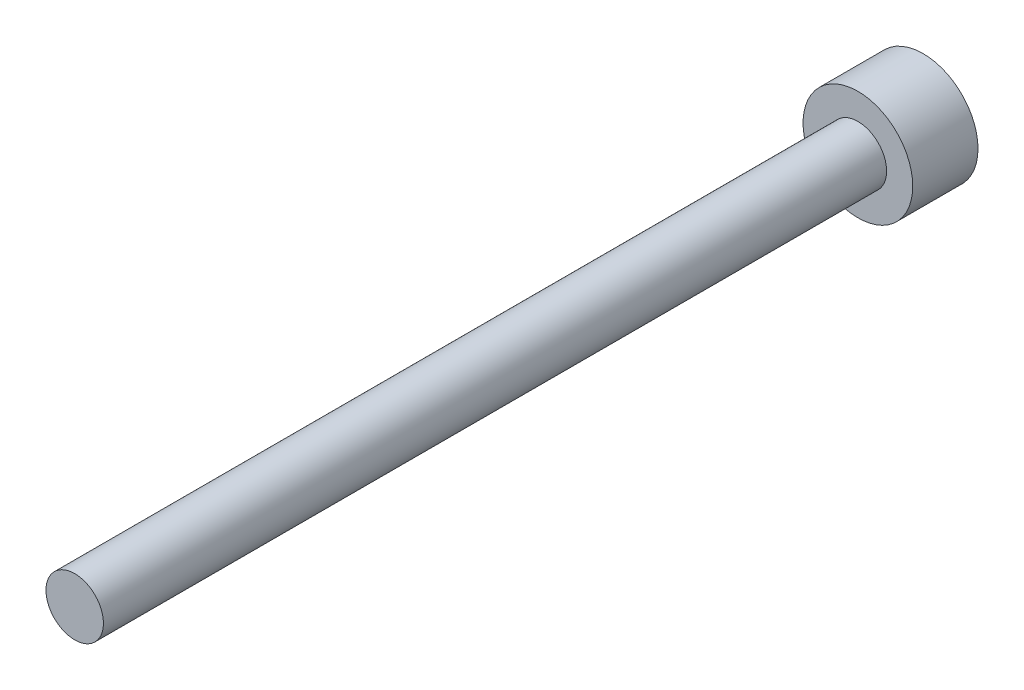
ISO-10303-21;
HEADER;
FILE_DESCRIPTION(('STEP AP214'),'2;1');
FILE_NAME('part.step','',(''),(''),'','','');
FILE_SCHEMA(('AUTOMOTIVE_DESIGN { 1 0 10303 214 1 1 1 1 }'));
ENDSEC;
DATA;
#1=APPLICATION_CONTEXT('core data for automotive mechanical design processes');
#2=APPLICATION_PROTOCOL_DEFINITION('international standard','automotive_design',2000,#1);
#3=PRODUCT_CONTEXT('',#1,'mechanical');
#4=PRODUCT('Part','Part','',(#3));
#5=PRODUCT_RELATED_PRODUCT_CATEGORY('part','',(#4));
#6=PRODUCT_DEFINITION_FORMATION('','',#4);
#7=PRODUCT_DEFINITION_CONTEXT('part definition',#1,'design');
#8=PRODUCT_DEFINITION('design','',#6,#7);
#9=PRODUCT_DEFINITION_SHAPE('','',#8);
#10=(LENGTH_UNIT() NAMED_UNIT(*) SI_UNIT(.MILLI.,.METRE.));
#11=(NAMED_UNIT(*) PLANE_ANGLE_UNIT() SI_UNIT($,.RADIAN.));
#12=(NAMED_UNIT(*) SI_UNIT($,.STERADIAN.) SOLID_ANGLE_UNIT());
#13=UNCERTAINTY_MEASURE_WITH_UNIT(LENGTH_MEASURE(1.E-05),#10,'distance_accuracy_value','');
#14=(GEOMETRIC_REPRESENTATION_CONTEXT(3) GLOBAL_UNCERTAINTY_ASSIGNED_CONTEXT((#13)) GLOBAL_UNIT_ASSIGNED_CONTEXT((#10,
#11,#12)) REPRESENTATION_CONTEXT('',''));
#15=CARTESIAN_POINT('',(0.,0.,0.));
#16=DIRECTION('',(0.,0.,1.));
#17=DIRECTION('',(1.,0.,0.));
#18=AXIS2_PLACEMENT_3D('',#15,#16,#17);
#19=CARTESIAN_POINT('',(0.,0.,6.35));
#20=DIRECTION('',(0.,0.,-1.));
#21=DIRECTION('',(-1.,0.,0.));
#22=AXIS2_PLACEMENT_3D('',#19,#20,#21);
#23=CYLINDRICAL_SURFACE('',#22,5.334);
#24=CARTESIAN_POINT('',(0.,0.,6.35));
#25=DIRECTION('',(0.,0.,1.));
#26=DIRECTION('',(1.,0.,0.));
#27=AXIS2_PLACEMENT_3D('',#24,#25,#26);
#28=CIRCLE('',#27,5.334);
#29=CARTESIAN_POINT('',(5.334,0.,6.35));
#30=VERTEX_POINT('',#29);
#31=EDGE_CURVE('E37',#30,#30,#28,.T.);
#32=ORIENTED_EDGE('',*,*,#31,.F.);
#33=EDGE_LOOP('',(#32));
#34=FACE_BOUND('',#33,.T.);
#35=CARTESIAN_POINT('',(0.,0.,0.));
#36=DIRECTION('',(0.,0.,1.));
#37=DIRECTION('',(1.,0.,0.));
#38=AXIS2_PLACEMENT_3D('',#35,#36,#37);
#39=CIRCLE('',#38,5.334);
#40=CARTESIAN_POINT('',(5.334,0.,0.));
#41=VERTEX_POINT('',#40);
#42=EDGE_CURVE('E33',#41,#41,#39,.T.);
#43=ORIENTED_EDGE('',*,*,#42,.T.);
#44=EDGE_LOOP('',(#43));
#45=FACE_BOUND('',#44,.T.);
#46=ADVANCED_FACE('F30',(#34,#45),#23,.T.);
#47=CARTESIAN_POINT('',(0.,0.,6.35));
#48=DIRECTION('',(0.,0.,1.));
#49=DIRECTION('',(1.,0.,0.));
#50=AXIS2_PLACEMENT_3D('',#47,#48,#49);
#51=PLANE('',#50);
#52=CARTESIAN_POINT('',(0.,0.,6.35));
#53=DIRECTION('',(0.,0.,1.));
#54=DIRECTION('',(1.,0.,0.));
#55=AXIS2_PLACEMENT_3D('',#52,#53,#54);
#56=CIRCLE('',#55,2.794);
#57=CARTESIAN_POINT('',(-2.794,0.,6.34999999999999));
#58=VERTEX_POINT('',#57);
#59=EDGE_CURVE('E10',#58,#58,#56,.T.);
#60=ORIENTED_EDGE('',*,*,#59,.F.);
#61=EDGE_LOOP('',(#60));
#62=FACE_BOUND('',#61,.T.);
#63=ORIENTED_EDGE('',*,*,#31,.T.);
#64=EDGE_LOOP('',(#63));
#65=FACE_BOUND('',#64,.T.);
#66=ADVANCED_FACE('F54',(#62,#65),#51,.T.);
#67=CARTESIAN_POINT('',(0.,0.,0.));
#68=DIRECTION('',(0.,0.,1.));
#69=DIRECTION('',(1.,0.,0.));
#70=AXIS2_PLACEMENT_3D('',#67,#68,#69);
#71=PLANE('',#70);
#72=ORIENTED_EDGE('',*,*,#42,.F.);
#73=EDGE_LOOP('',(#72));
#74=FACE_BOUND('',#73,.T.);
#75=ADVANCED_FACE('F51',(#74),#71,.F.);
#76=CARTESIAN_POINT('',(0.,0.,82.55));
#77=DIRECTION('',(0.,0.,-1.));
#78=DIRECTION('',(-1.,0.,0.));
#79=AXIS2_PLACEMENT_3D('',#76,#77,#78);
#80=CYLINDRICAL_SURFACE('',#79,2.794);
#81=CARTESIAN_POINT('',(0.,0.,82.55));
#82=DIRECTION('',(0.,0.,1.));
#83=DIRECTION('',(1.,0.,0.));
#84=AXIS2_PLACEMENT_3D('',#81,#82,#83);
#85=CIRCLE('',#84,2.794);
#86=CARTESIAN_POINT('',(-2.794,0.,82.55));
#87=VERTEX_POINT('',#86);
#88=EDGE_CURVE('E43',#87,#87,#85,.T.);
#89=CARTESIAN_POINT('',(-2.794,0.,82.55));
#90=CARTESIAN_POINT('',(-2.794,0.,81.75625));
#91=CARTESIAN_POINT('',(-2.794,0.,80.9625));
#92=CARTESIAN_POINT('',(-2.794,0.,79.375));
#93=CARTESIAN_POINT('',(-2.794,0.,78.58125));
#94=CARTESIAN_POINT('',(-2.794,0.,76.99375));
#95=CARTESIAN_POINT('',(-2.794,0.,76.2));
#96=CARTESIAN_POINT('',(-2.794,0.,74.6125));
#97=CARTESIAN_POINT('',(-2.794,0.,73.81875));
#98=CARTESIAN_POINT('',(-2.794,0.,72.23125));
#99=CARTESIAN_POINT('',(-2.794,0.,71.4375));
#100=CARTESIAN_POINT('',(-2.794,0.,69.85));
#101=CARTESIAN_POINT('',(-2.794,0.,69.05625));
#102=CARTESIAN_POINT('',(-2.794,0.,67.46875));
#103=CARTESIAN_POINT('',(-2.794,0.,66.675));
#104=CARTESIAN_POINT('',(-2.794,0.,65.0875));
#105=CARTESIAN_POINT('',(-2.794,0.,64.29375));
#106=CARTESIAN_POINT('',(-2.794,0.,62.70625));
#107=CARTESIAN_POINT('',(-2.794,0.,61.9125));
#108=CARTESIAN_POINT('',(-2.794,0.,60.325));
#109=CARTESIAN_POINT('',(-2.794,0.,59.53125));
#110=CARTESIAN_POINT('',(-2.794,0.,57.94375));
#111=CARTESIAN_POINT('',(-2.794,0.,57.15));
#112=CARTESIAN_POINT('',(-2.794,0.,55.5625));
#113=CARTESIAN_POINT('',(-2.794,0.,54.76875));
#114=CARTESIAN_POINT('',(-2.794,0.,53.18125));
#115=CARTESIAN_POINT('',(-2.794,0.,52.3875));
#116=CARTESIAN_POINT('',(-2.794,0.,50.8));
#117=CARTESIAN_POINT('',(-2.794,0.,50.00625));
#118=CARTESIAN_POINT('',(-2.794,0.,48.41875));
#119=CARTESIAN_POINT('',(-2.794,0.,47.625));
#120=CARTESIAN_POINT('',(-2.794,0.,46.0375));
#121=CARTESIAN_POINT('',(-2.794,0.,45.24375));
#122=CARTESIAN_POINT('',(-2.794,0.,43.65625));
#123=CARTESIAN_POINT('',(-2.794,0.,42.8625));
#124=CARTESIAN_POINT('',(-2.794,0.,41.275));
#125=CARTESIAN_POINT('',(-2.794,0.,40.48125));
#126=CARTESIAN_POINT('',(-2.794,0.,38.89375));
#127=CARTESIAN_POINT('',(-2.794,0.,38.1));
#128=CARTESIAN_POINT('',(-2.794,0.,36.5125));
#129=CARTESIAN_POINT('',(-2.794,0.,35.71875));
#130=CARTESIAN_POINT('',(-2.794,0.,34.13125));
#131=CARTESIAN_POINT('',(-2.794,0.,33.3375));
#132=CARTESIAN_POINT('',(-2.794,0.,31.75));
#133=CARTESIAN_POINT('',(-2.794,0.,30.95625));
#134=CARTESIAN_POINT('',(-2.794,0.,29.36875));
#135=CARTESIAN_POINT('',(-2.794,0.,28.575));
#136=CARTESIAN_POINT('',(-2.794,0.,26.9875));
#137=CARTESIAN_POINT('',(-2.794,0.,26.19375));
#138=CARTESIAN_POINT('',(-2.794,0.,24.60625));
#139=CARTESIAN_POINT('',(-2.794,0.,23.8125));
#140=CARTESIAN_POINT('',(-2.794,0.,22.225));
#141=CARTESIAN_POINT('',(-2.794,0.,21.43125));
#142=CARTESIAN_POINT('',(-2.794,0.,19.84375));
#143=CARTESIAN_POINT('',(-2.794,0.,19.05));
#144=CARTESIAN_POINT('',(-2.794,0.,17.4625));
#145=CARTESIAN_POINT('',(-2.794,0.,16.66875));
#146=CARTESIAN_POINT('',(-2.794,0.,15.08125));
#147=CARTESIAN_POINT('',(-2.794,0.,14.2875));
#148=CARTESIAN_POINT('',(-2.794,0.,12.7));
#149=CARTESIAN_POINT('',(-2.794,0.,11.90625));
#150=CARTESIAN_POINT('',(-2.794,0.,10.31875));
#151=CARTESIAN_POINT('',(-2.794,0.,9.525));
#152=CARTESIAN_POINT('',(-2.794,0.,7.93749999999999));
#153=CARTESIAN_POINT('',(-2.794,0.,7.14375));
#154=CARTESIAN_POINT('',(-2.794,0.,6.34999999999999));
#155=B_SPLINE_CURVE_WITH_KNOTS('',3,(#89,#90,#91,#92,#93,#94,#95,#96,#97,#98,#99,#100,#101,#102,
#103,#104,#105,#106,#107,#108,#109,#110,#111,#112,#113,#114,#115,#116,#117,#118,#119,#120,#121,
#122,#123,#124,#125,#126,#127,#128,#129,#130,#131,#132,#133,#134,#135,#136,#137,#138,#139,#140,
#141,#142,#143,#144,#145,#146,#147,#148,#149,#150,#151,#152,#153,#154),.UNSPECIFIED.,.F.,.F.,(4,
2,2,2,2,2,2,2,2,2,2,2,2,2,2,2,2,2,2,2,2,2,2,2,2,2,2,2,2,2,2,2,4),(0.,2.38124999999999,
4.76249999999999,7.14374999999999,9.52499999999999,11.90625,14.2875,16.66875,19.05,21.43125,
23.8125,26.19375,28.575,30.95625,33.3375,35.71875,38.1,40.48125,42.8625,45.24375,47.625,
50.00625,52.3875,54.76875,57.15,59.53125,61.9125,64.29375,66.675,69.05625,71.4375,73.81875,
76.2),.UNSPECIFIED.);
#156=EDGE_CURVE('BSEAM53',#87,#58,#155,.T.);
#157=ORIENTED_EDGE('',*,*,#88,.F.);
#158=ORIENTED_EDGE('',*,*,#59,.T.);
#159=ORIENTED_EDGE('',*,*,#156,.T.);
#160=ORIENTED_EDGE('',*,*,#156,.F.);
#161=EDGE_LOOP('',(#157,#159,#158,#160));
#162=FACE_BOUND('',#161,.T.);
#163=ADVANCED_FACE('F53',(#162),#80,.T.);
#164=CARTESIAN_POINT('',(0.,0.,82.55));
#165=DIRECTION('',(0.,0.,1.));
#166=DIRECTION('',(1.,0.,0.));
#167=AXIS2_PLACEMENT_3D('',#164,#165,#166);
#168=PLANE('',#167);
#169=ORIENTED_EDGE('',*,*,#88,.T.);
#170=EDGE_LOOP('',(#169));
#171=FACE_BOUND('',#170,.T.);
#172=ADVANCED_FACE('F59',(#171),#168,.T.);
#173=CLOSED_SHELL('',(#46,#66,#75,#163,#172));
#174=MANIFOLD_SOLID_BREP('B2',#173);
#175=ADVANCED_BREP_SHAPE_REPRESENTATION('',(#18,#174),#14);
#176=SHAPE_DEFINITION_REPRESENTATION(#9,#175);
ENDSEC;
END-ISO-10303-21;
